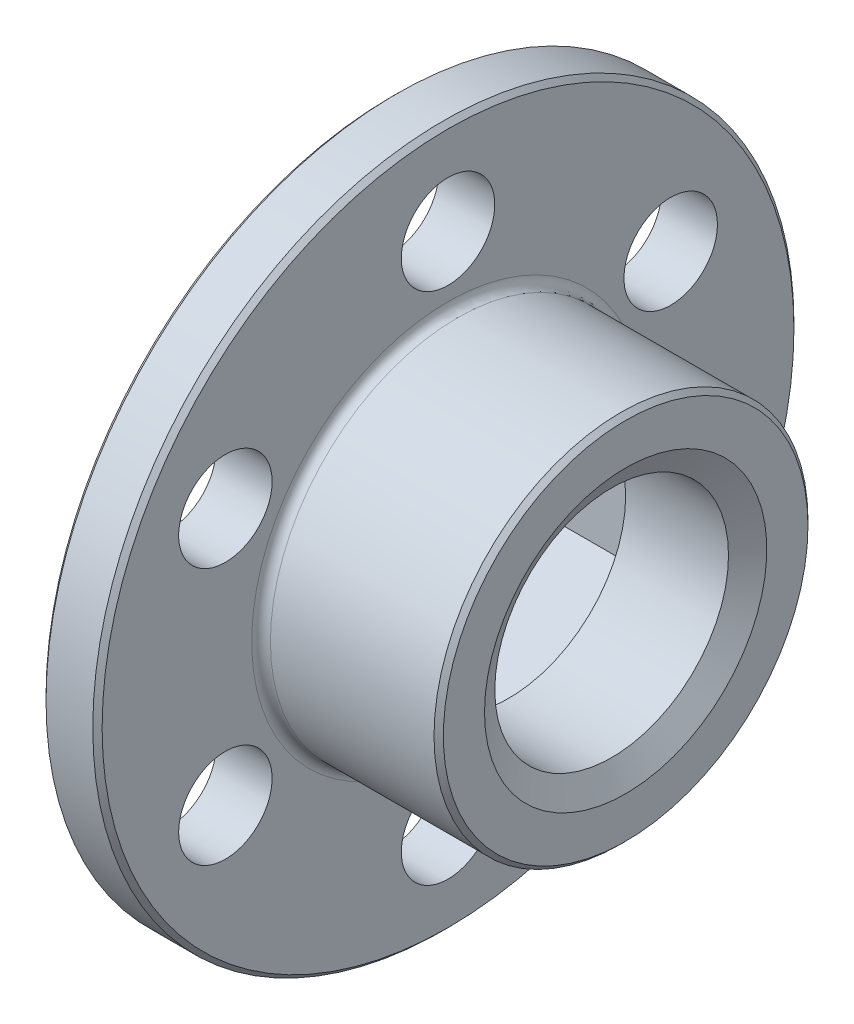
ISO-10303-21;
HEADER;
FILE_DESCRIPTION(('STEP AP214'),'2;1');
FILE_NAME('part.step','',(''),(''),'','','');
FILE_SCHEMA(('AUTOMOTIVE_DESIGN { 1 0 10303 214 1 1 1 1 }'));
ENDSEC;
DATA;
#1=APPLICATION_CONTEXT('core data for automotive mechanical design processes');
#2=APPLICATION_PROTOCOL_DEFINITION('international standard','automotive_design',2000,#1);
#3=PRODUCT_CONTEXT('',#1,'mechanical');
#4=PRODUCT('Part','Part','',(#3));
#5=PRODUCT_RELATED_PRODUCT_CATEGORY('part','',(#4));
#6=PRODUCT_DEFINITION_FORMATION('','',#4);
#7=PRODUCT_DEFINITION_CONTEXT('part definition',#1,'design');
#8=PRODUCT_DEFINITION('design','',#6,#7);
#9=PRODUCT_DEFINITION_SHAPE('','',#8);
#10=(LENGTH_UNIT() NAMED_UNIT(*) SI_UNIT(.MILLI.,.METRE.));
#11=(NAMED_UNIT(*) PLANE_ANGLE_UNIT() SI_UNIT($,.RADIAN.));
#12=(NAMED_UNIT(*) SI_UNIT($,.STERADIAN.) SOLID_ANGLE_UNIT());
#13=UNCERTAINTY_MEASURE_WITH_UNIT(LENGTH_MEASURE(1.E-05),#10,'distance_accuracy_value','');
#14=(GEOMETRIC_REPRESENTATION_CONTEXT(3) GLOBAL_UNCERTAINTY_ASSIGNED_CONTEXT((#13)) GLOBAL_UNIT_ASSIGNED_CONTEXT((#10,
#11,#12)) REPRESENTATION_CONTEXT('',''));
#15=CARTESIAN_POINT('',(0.,0.,0.));
#16=DIRECTION('',(0.,0.,1.));
#17=DIRECTION('',(1.,0.,0.));
#18=AXIS2_PLACEMENT_3D('',#15,#16,#17);
#19=CARTESIAN_POINT('',(0.,0.,0.));
#20=DIRECTION('',(-1.,0.,0.));
#21=DIRECTION('',(0.,0.,1.));
#22=AXIS2_PLACEMENT_3D('',#19,#20,#21);
#23=PLANE('',#22);
#24=DIRECTION('',(0.,0.5,0.866025403784439));
#25=VECTOR('',#24,1.);
#26=CARTESIAN_POINT('',(0.,17.5,-30.3108891324554));
#27=LINE('',#26,#25);
#28=CARTESIAN_POINT('',(0.,17.5,-30.3108891324554));
#29=VERTEX_POINT('',#28);
#30=CARTESIAN_POINT('',(0.,35.,0.));
#31=VERTEX_POINT('',#30);
#32=EDGE_CURVE('E138',#29,#31,#27,.T.);
#33=ORIENTED_EDGE('',*,*,#32,.T.);
#34=DIRECTION('',(0.,-0.5,0.866025403784439));
#35=VECTOR('',#34,1.);
#36=CARTESIAN_POINT('',(0.,35.,0.));
#37=LINE('',#36,#35);
#38=CARTESIAN_POINT('',(0.,17.5,30.3108891324554));
#39=VERTEX_POINT('',#38);
#40=EDGE_CURVE('E120',#31,#39,#37,.T.);
#41=ORIENTED_EDGE('',*,*,#40,.T.);
#42=DIRECTION('',(0.,-1.,0.));
#43=VECTOR('',#42,1.);
#44=CARTESIAN_POINT('',(0.,17.5,30.3108891324554));
#45=LINE('',#44,#43);
#46=CARTESIAN_POINT('',(0.,-17.5,30.3108891324554));
#47=VERTEX_POINT('',#46);
#48=EDGE_CURVE('E52',#39,#47,#45,.T.);
#49=ORIENTED_EDGE('',*,*,#48,.T.);
#50=DIRECTION('',(0.,-0.5,-0.866025403784439));
#51=VECTOR('',#50,1.);
#52=CARTESIAN_POINT('',(0.,-17.5,30.3108891324554));
#53=LINE('',#52,#51);
#54=CARTESIAN_POINT('',(0.,-35.,0.));
#55=VERTEX_POINT('',#54);
#56=EDGE_CURVE('E100',#47,#55,#53,.T.);
#57=ORIENTED_EDGE('',*,*,#56,.T.);
#58=DIRECTION('',(0.,0.5,-0.866025403784439));
#59=VECTOR('',#58,1.);
#60=CARTESIAN_POINT('',(0.,-35.,0.));
#61=LINE('',#60,#59);
#62=CARTESIAN_POINT('',(0.,-17.5,-30.3108891324554));
#63=VERTEX_POINT('',#62);
#64=EDGE_CURVE('E110',#55,#63,#61,.T.);
#65=ORIENTED_EDGE('',*,*,#64,.T.);
#66=DIRECTION('',(0.,1.,0.));
#67=VECTOR('',#66,1.);
#68=CARTESIAN_POINT('',(0.,-17.5,-30.3108891324554));
#69=LINE('',#68,#67);
#70=EDGE_CURVE('E114',#63,#29,#69,.T.);
#71=ORIENTED_EDGE('',*,*,#70,.T.);
#72=EDGE_LOOP('',(#33,#41,#49,#57,#65,#71));
#73=FACE_BOUND('',#72,.T.);
#74=CARTESIAN_POINT('',(0.,27.5000000000006,47.6313972081438));
#75=DIRECTION('',(-1.,0.,0.));
#76=DIRECTION('',(0.,-0.866025403784433,0.50000000000001));
#77=AXIS2_PLACEMENT_3D('',#74,#75,#76);
#78=CIRCLE('',#77,10.);
#79=CARTESIAN_POINT('',(0.,18.8397459621562,52.6313972081439));
#80=VERTEX_POINT('',#79);
#81=EDGE_CURVE('E151',#80,#80,#78,.T.);
#82=ORIENTED_EDGE('',*,*,#81,.F.);
#83=EDGE_LOOP('',(#82));
#84=FACE_BOUND('',#83,.T.);
#85=CARTESIAN_POINT('',(0.,-27.4999999999996,47.6313972081444));
#86=DIRECTION('',(-1.,0.,0.));
#87=DIRECTION('',(0.,-0.866025403784443,-0.499999999999992));
#88=AXIS2_PLACEMENT_3D('',#85,#86,#87);
#89=CIRCLE('',#88,10.);
#90=CARTESIAN_POINT('',(0.,-36.160254037844,42.6313972081445));
#91=VERTEX_POINT('',#90);
#92=EDGE_CURVE('E157',#91,#91,#89,.T.);
#93=ORIENTED_EDGE('',*,*,#92,.F.);
#94=EDGE_LOOP('',(#93));
#95=FACE_BOUND('',#94,.T.);
#96=CARTESIAN_POINT('',(0.,-55.,0.));
#97=DIRECTION('',(-1.,0.,0.));
#98=DIRECTION('',(0.,0.,-1.));
#99=AXIS2_PLACEMENT_3D('',#96,#97,#98);
#100=CIRCLE('',#99,10.);
#101=CARTESIAN_POINT('',(0.,-55.,-10.));
#102=VERTEX_POINT('',#101);
#103=EDGE_CURVE('E163',#102,#102,#100,.T.);
#104=ORIENTED_EDGE('',*,*,#103,.F.);
#105=EDGE_LOOP('',(#104));
#106=FACE_BOUND('',#105,.T.);
#107=CARTESIAN_POINT('',(0.,-27.5000000000002,-47.631397208144));
#108=DIRECTION('',(-1.,0.,0.));
#109=DIRECTION('',(0.,0.866025403784436,-0.500000000000004));
#110=AXIS2_PLACEMENT_3D('',#107,#108,#109);
#111=CIRCLE('',#110,10.);
#112=CARTESIAN_POINT('',(0.,-18.8397459621559,-52.631397208144));
#113=VERTEX_POINT('',#112);
#114=EDGE_CURVE('E169',#113,#113,#111,.T.);
#115=ORIENTED_EDGE('',*,*,#114,.F.);
#116=EDGE_LOOP('',(#115));
#117=FACE_BOUND('',#116,.T.);
#118=CARTESIAN_POINT('',(0.,27.4999999999999,-47.6313972081442));
#119=DIRECTION('',(-1.,0.,0.));
#120=DIRECTION('',(0.,0.86602540378444,0.499999999999998));
#121=AXIS2_PLACEMENT_3D('',#118,#119,#120);
#122=CIRCLE('',#121,10.);
#123=CARTESIAN_POINT('',(0.,36.1602540378443,-42.6313972081442));
#124=VERTEX_POINT('',#123);
#125=EDGE_CURVE('E175',#124,#124,#122,.T.);
#126=ORIENTED_EDGE('',*,*,#125,.F.);
#127=EDGE_LOOP('',(#126));
#128=FACE_BOUND('',#127,.T.);
#129=CARTESIAN_POINT('',(0.,55.,0.));
#130=DIRECTION('',(-1.,0.,0.));
#131=DIRECTION('',(0.,0.,1.));
#132=AXIS2_PLACEMENT_3D('',#129,#130,#131);
#133=CIRCLE('',#132,10.);
#134=CARTESIAN_POINT('',(0.,55.,10.));
#135=VERTEX_POINT('',#134);
#136=EDGE_CURVE('E181',#135,#135,#133,.T.);
#137=ORIENTED_EDGE('',*,*,#136,.F.);
#138=EDGE_LOOP('',(#137));
#139=FACE_BOUND('',#138,.T.);
#140=CARTESIAN_POINT('',(0.,0.,0.));
#141=DIRECTION('',(-1.,0.,0.));
#142=DIRECTION('',(0.,0.,1.));
#143=AXIS2_PLACEMENT_3D('',#140,#141,#142);
#144=CIRCLE('',#143,74.0000000000001);
#145=CARTESIAN_POINT('',(0.,0.,74.0000000000001));
#146=VERTEX_POINT('',#145);
#147=EDGE_CURVE('E199',#146,#146,#144,.T.);
#148=ORIENTED_EDGE('',*,*,#147,.T.);
#149=EDGE_LOOP('',(#148));
#150=FACE_BOUND('',#149,.T.);
#151=ADVANCED_FACE('F36',(#73,#84,#95,#106,#117,#128,#139,#150),#23,.T.);
#152=CARTESIAN_POINT('',(0.,0.,0.));
#153=DIRECTION('',(-1.,0.,0.));
#154=DIRECTION('',(0.,0.,1.));
#155=AXIS2_PLACEMENT_3D('',#152,#153,#154);
#156=CYLINDRICAL_SURFACE('',#155,25.);
#157=CARTESIAN_POINT('',(25.,0.,0.));
#158=DIRECTION('',(1.,0.,0.));
#159=DIRECTION('',(0.,0.,-1.));
#160=AXIS2_PLACEMENT_3D('',#157,#158,#159);
#161=CIRCLE('',#160,25.);
#162=CARTESIAN_POINT('',(25.,0.,-25.));
#163=VERTEX_POINT('',#162);
#164=EDGE_CURVE('E40',#163,#163,#161,.F.);
#165=ORIENTED_EDGE('',*,*,#164,.T.);
#166=EDGE_LOOP('',(#165));
#167=FACE_BOUND('',#166,.T.);
#168=CARTESIAN_POINT('',(47.,0.,0.));
#169=DIRECTION('',(-1.,0.,0.));
#170=DIRECTION('',(0.,0.,1.));
#171=AXIS2_PLACEMENT_3D('',#168,#169,#170);
#172=CIRCLE('',#171,25.);
#173=CARTESIAN_POINT('',(47.,0.,25.));
#174=VERTEX_POINT('',#173);
#175=EDGE_CURVE('E145',#174,#174,#172,.T.);
#176=ORIENTED_EDGE('',*,*,#175,.F.);
#177=EDGE_LOOP('',(#176));
#178=FACE_BOUND('',#177,.T.);
#179=ADVANCED_FACE('F218',(#167,#178),#156,.F.);
#180=CARTESIAN_POINT('',(50.,0.,0.));
#181=DIRECTION('',(1.,0.,0.));
#182=DIRECTION('',(0.,0.,-1.));
#183=AXIS2_PLACEMENT_3D('',#180,#181,#182);
#184=PLANE('',#183);
#185=CARTESIAN_POINT('',(50.,0.,0.));
#186=DIRECTION('',(-1.,0.,0.));
#187=DIRECTION('',(0.,0.,1.));
#188=AXIS2_PLACEMENT_3D('',#185,#186,#187);
#189=CIRCLE('',#188,30.1961524227067);
#190=CARTESIAN_POINT('',(50.,0.,30.1961524227067));
#191=VERTEX_POINT('',#190);
#192=EDGE_CURVE('E148',#191,#191,#189,.T.);
#193=ORIENTED_EDGE('',*,*,#192,.T.);
#194=EDGE_LOOP('',(#193));
#195=FACE_BOUND('',#194,.T.);
#196=CARTESIAN_POINT('',(50.,0.,0.));
#197=DIRECTION('',(1.,0.,0.));
#198=DIRECTION('',(0.,0.,-1.));
#199=AXIS2_PLACEMENT_3D('',#196,#197,#198);
#200=CIRCLE('',#199,39.);
#201=CARTESIAN_POINT('',(50.,0.,-39.));
#202=VERTEX_POINT('',#201);
#203=EDGE_CURVE('E196',#202,#202,#200,.T.);
#204=ORIENTED_EDGE('',*,*,#203,.T.);
#205=EDGE_LOOP('',(#204));
#206=FACE_BOUND('',#205,.T.);
#207=ADVANCED_FACE('F223',(#195,#206),#184,.T.);
#208=CARTESIAN_POINT('',(0.,0.,0.));
#209=DIRECTION('',(-1.,0.,0.));
#210=DIRECTION('',(0.,0.,1.));
#211=AXIS2_PLACEMENT_3D('',#208,#209,#210);
#212=CYLINDRICAL_SURFACE('',#211,40.);
#213=CARTESIAN_POINT('',(49.,0.,0.));
#214=DIRECTION('',(1.,0.,0.));
#215=DIRECTION('',(0.,0.,-1.));
#216=AXIS2_PLACEMENT_3D('',#213,#214,#215);
#217=CIRCLE('',#216,40.);
#218=CARTESIAN_POINT('',(49.,0.,-40.));
#219=VERTEX_POINT('',#218);
#220=EDGE_CURVE('E193',#219,#219,#217,.F.);
#221=ORIENTED_EDGE('',*,*,#220,.T.);
#222=EDGE_LOOP('',(#221));
#223=FACE_BOUND('',#222,.T.);
#224=CARTESIAN_POINT('',(14.,0.,0.));
#225=DIRECTION('',(1.,0.,0.));
#226=DIRECTION('',(0.,0.,-1.));
#227=AXIS2_PLACEMENT_3D('',#224,#225,#226);
#228=CIRCLE('',#227,40.);
#229=CARTESIAN_POINT('',(14.,0.,-40.));
#230=VERTEX_POINT('',#229);
#231=EDGE_CURVE('E190',#230,#230,#228,.T.);
#232=ORIENTED_EDGE('',*,*,#231,.T.);
#233=EDGE_LOOP('',(#232));
#234=FACE_BOUND('',#233,.T.);
#235=ADVANCED_FACE('F240',(#223,#234),#212,.T.);
#236=CARTESIAN_POINT('',(12.,0.,0.));
#237=DIRECTION('',(1.,0.,0.));
#238=DIRECTION('',(0.,0.,-1.));
#239=AXIS2_PLACEMENT_3D('',#236,#237,#238);
#240=PLANE('',#239);
#241=CARTESIAN_POINT('',(12.,27.5000000000006,47.6313972081438));
#242=DIRECTION('',(-1.,0.,0.));
#243=DIRECTION('',(0.,-0.866025403784433,0.50000000000001));
#244=AXIS2_PLACEMENT_3D('',#241,#242,#243);
#245=CIRCLE('',#244,10.);
#246=CARTESIAN_POINT('',(12.,18.8397459621562,52.6313972081439));
#247=VERTEX_POINT('',#246);
#248=EDGE_CURVE('E154',#247,#247,#245,.T.);
#249=ORIENTED_EDGE('',*,*,#248,.T.);
#250=EDGE_LOOP('',(#249));
#251=FACE_BOUND('',#250,.T.);
#252=CARTESIAN_POINT('',(12.,-27.4999999999996,47.6313972081444));
#253=DIRECTION('',(-1.,0.,0.));
#254=DIRECTION('',(0.,-0.866025403784443,-0.499999999999992));
#255=AXIS2_PLACEMENT_3D('',#252,#253,#254);
#256=CIRCLE('',#255,10.);
#257=CARTESIAN_POINT('',(12.,-36.160254037844,42.6313972081445));
#258=VERTEX_POINT('',#257);
#259=EDGE_CURVE('E160',#258,#258,#256,.T.);
#260=ORIENTED_EDGE('',*,*,#259,.T.);
#261=EDGE_LOOP('',(#260));
#262=FACE_BOUND('',#261,.T.);
#263=CARTESIAN_POINT('',(12.,-55.,0.));
#264=DIRECTION('',(-1.,0.,0.));
#265=DIRECTION('',(0.,0.,-1.));
#266=AXIS2_PLACEMENT_3D('',#263,#264,#265);
#267=CIRCLE('',#266,10.);
#268=CARTESIAN_POINT('',(12.,-55.,-10.));
#269=VERTEX_POINT('',#268);
#270=EDGE_CURVE('E166',#269,#269,#267,.T.);
#271=ORIENTED_EDGE('',*,*,#270,.T.);
#272=EDGE_LOOP('',(#271));
#273=FACE_BOUND('',#272,.T.);
#274=CARTESIAN_POINT('',(12.,-27.5000000000002,-47.631397208144));
#275=DIRECTION('',(-1.,0.,0.));
#276=DIRECTION('',(0.,0.866025403784436,-0.500000000000004));
#277=AXIS2_PLACEMENT_3D('',#274,#275,#276);
#278=CIRCLE('',#277,10.);
#279=CARTESIAN_POINT('',(12.,-18.8397459621559,-52.631397208144));
#280=VERTEX_POINT('',#279);
#281=EDGE_CURVE('E172',#280,#280,#278,.T.);
#282=ORIENTED_EDGE('',*,*,#281,.T.);
#283=EDGE_LOOP('',(#282));
#284=FACE_BOUND('',#283,.T.);
#285=CARTESIAN_POINT('',(12.,27.4999999999999,-47.6313972081442));
#286=DIRECTION('',(-1.,0.,0.));
#287=DIRECTION('',(0.,0.86602540378444,0.499999999999998));
#288=AXIS2_PLACEMENT_3D('',#285,#286,#287);
#289=CIRCLE('',#288,10.);
#290=CARTESIAN_POINT('',(12.,36.1602540378443,-42.6313972081442));
#291=VERTEX_POINT('',#290);
#292=EDGE_CURVE('E178',#291,#291,#289,.T.);
#293=ORIENTED_EDGE('',*,*,#292,.T.);
#294=EDGE_LOOP('',(#293));
#295=FACE_BOUND('',#294,.T.);
#296=CARTESIAN_POINT('',(12.,55.,0.));
#297=DIRECTION('',(-1.,0.,0.));
#298=DIRECTION('',(0.,0.,1.));
#299=AXIS2_PLACEMENT_3D('',#296,#297,#298);
#300=CIRCLE('',#299,10.);
#301=CARTESIAN_POINT('',(12.,55.,10.));
#302=VERTEX_POINT('',#301);
#303=EDGE_CURVE('E184',#302,#302,#300,.T.);
#304=ORIENTED_EDGE('',*,*,#303,.T.);
#305=EDGE_LOOP('',(#304));
#306=FACE_BOUND('',#305,.T.);
#307=CARTESIAN_POINT('',(12.,0.,0.));
#308=DIRECTION('',(1.,0.,0.));
#309=DIRECTION('',(0.,0.,-1.));
#310=AXIS2_PLACEMENT_3D('',#307,#308,#309);
#311=CIRCLE('',#310,74.);
#312=CARTESIAN_POINT('',(12.,0.,-74.));
#313=VERTEX_POINT('',#312);
#314=EDGE_CURVE('E11',#313,#313,#311,.T.);
#315=ORIENTED_EDGE('',*,*,#314,.T.);
#316=EDGE_LOOP('',(#315));
#317=FACE_BOUND('',#316,.T.);
#318=CARTESIAN_POINT('',(12.,0.,0.));
#319=DIRECTION('',(1.,0.,0.));
#320=DIRECTION('',(0.,0.,-1.));
#321=AXIS2_PLACEMENT_3D('',#318,#319,#320);
#322=CIRCLE('',#321,42.);
#323=CARTESIAN_POINT('',(12.,0.,-42.));
#324=VERTEX_POINT('',#323);
#325=EDGE_CURVE('E187',#324,#324,#322,.F.);
#326=ORIENTED_EDGE('',*,*,#325,.T.);
#327=EDGE_LOOP('',(#326));
#328=FACE_BOUND('',#327,.T.);
#329=ADVANCED_FACE('F243',(#251,#262,#273,#284,#295,#306,#317,#328),#240,.T.);
#330=CARTESIAN_POINT('',(0.,0.,0.));
#331=DIRECTION('',(-1.,0.,0.));
#332=DIRECTION('',(0.,0.,1.));
#333=AXIS2_PLACEMENT_3D('',#330,#331,#332);
#334=CYLINDRICAL_SURFACE('',#333,75.);
#335=CARTESIAN_POINT('',(0.999999999999918,0.,0.));
#336=DIRECTION('',(-1.,0.,0.));
#337=DIRECTION('',(0.,0.,1.));
#338=AXIS2_PLACEMENT_3D('',#335,#336,#337);
#339=CIRCLE('',#338,75.);
#340=CARTESIAN_POINT('',(0.999999999999918,0.,75.));
#341=VERTEX_POINT('',#340);
#342=EDGE_CURVE('E45',#341,#341,#339,.F.);
#343=ORIENTED_EDGE('',*,*,#342,.T.);
#344=EDGE_LOOP('',(#343));
#345=FACE_BOUND('',#344,.T.);
#346=CARTESIAN_POINT('',(11.,0.,0.));
#347=DIRECTION('',(1.,0.,0.));
#348=DIRECTION('',(0.,0.,-1.));
#349=AXIS2_PLACEMENT_3D('',#346,#347,#348);
#350=CIRCLE('',#349,75.);
#351=CARTESIAN_POINT('',(11.,0.,-75.));
#352=VERTEX_POINT('',#351);
#353=EDGE_CURVE('E202',#352,#352,#350,.F.);
#354=ORIENTED_EDGE('',*,*,#353,.T.);
#355=EDGE_LOOP('',(#354));
#356=FACE_BOUND('',#355,.T.);
#357=ADVANCED_FACE('F208',(#345,#356),#334,.T.);
#358=CARTESIAN_POINT('',(14.,0.,0.));
#359=DIRECTION('',(1.,0.,0.));
#360=DIRECTION('',(0.,0.,-1.));
#361=AXIS2_PLACEMENT_3D('',#358,#359,#360);
#362=TOROIDAL_SURFACE('',#361,42.,2.);
#363=ORIENTED_EDGE('',*,*,#231,.F.);
#364=EDGE_LOOP('',(#363));
#365=FACE_BOUND('',#364,.T.);
#366=ORIENTED_EDGE('',*,*,#325,.F.);
#367=EDGE_LOOP('',(#366));
#368=FACE_BOUND('',#367,.T.);
#369=ADVANCED_FACE('F228',(#365,#368),#362,.F.);
#370=CARTESIAN_POINT('',(49.,0.,0.));
#371=DIRECTION('',(-1.,0.,0.));
#372=DIRECTION('',(0.,0.,1.));
#373=AXIS2_PLACEMENT_3D('',#370,#371,#372);
#374=CONICAL_SURFACE('',#373,40.,0.785398163397462);
#375=ORIENTED_EDGE('',*,*,#203,.F.);
#376=EDGE_LOOP('',(#375));
#377=FACE_BOUND('',#376,.T.);
#378=ORIENTED_EDGE('',*,*,#220,.F.);
#379=EDGE_LOOP('',(#378));
#380=FACE_BOUND('',#379,.T.);
#381=ADVANCED_FACE('F214',(#377,#380),#374,.T.);
#382=CARTESIAN_POINT('',(0.,0.,0.));
#383=DIRECTION('',(1.,0.,0.));
#384=DIRECTION('',(0.,0.,-1.));
#385=AXIS2_PLACEMENT_3D('',#382,#383,#384);
#386=CONICAL_SURFACE('',#385,74.0000000000001,0.785398163397455);
#387=ORIENTED_EDGE('',*,*,#342,.F.);
#388=EDGE_LOOP('',(#387));
#389=FACE_BOUND('',#388,.T.);
#390=ORIENTED_EDGE('',*,*,#147,.F.);
#391=EDGE_LOOP('',(#390));
#392=FACE_BOUND('',#391,.T.);
#393=ADVANCED_FACE('F211',(#389,#392),#386,.T.);
#394=CARTESIAN_POINT('',(11.,0.,0.));
#395=DIRECTION('',(-1.,0.,0.));
#396=DIRECTION('',(0.,0.,1.));
#397=AXIS2_PLACEMENT_3D('',#394,#395,#396);
#398=CONICAL_SURFACE('',#397,75.,0.785398163397455);
#399=ORIENTED_EDGE('',*,*,#314,.F.);
#400=EDGE_LOOP('',(#399));
#401=FACE_BOUND('',#400,.T.);
#402=ORIENTED_EDGE('',*,*,#353,.F.);
#403=EDGE_LOOP('',(#402));
#404=FACE_BOUND('',#403,.T.);
#405=ADVANCED_FACE('F38',(#401,#404),#398,.T.);
#406=CARTESIAN_POINT('',(-8.26577211769879,55.,0.));
#407=DIRECTION('',(-1.,0.,0.));
#408=DIRECTION('',(0.,0.,1.));
#409=AXIS2_PLACEMENT_3D('',#406,#407,#408);
#410=CYLINDRICAL_SURFACE('',#409,10.);
#411=ORIENTED_EDGE('',*,*,#303,.F.);
#412=EDGE_LOOP('',(#411));
#413=FACE_BOUND('',#412,.T.);
#414=ORIENTED_EDGE('',*,*,#136,.T.);
#415=EDGE_LOOP('',(#414));
#416=FACE_BOUND('',#415,.T.);
#417=ADVANCED_FACE('F299',(#413,#416),#410,.F.);
#418=CARTESIAN_POINT('',(-8.26577211769879,27.4999999999999,-47.6313972081442));
#419=DIRECTION('',(-1.,0.,0.));
#420=DIRECTION('',(0.,0.86602540378444,0.499999999999998));
#421=AXIS2_PLACEMENT_3D('',#418,#419,#420);
#422=CYLINDRICAL_SURFACE('',#421,10.);
#423=ORIENTED_EDGE('',*,*,#292,.F.);
#424=EDGE_LOOP('',(#423));
#425=FACE_BOUND('',#424,.T.);
#426=ORIENTED_EDGE('',*,*,#125,.T.);
#427=EDGE_LOOP('',(#426));
#428=FACE_BOUND('',#427,.T.);
#429=ADVANCED_FACE('F296',(#425,#428),#422,.F.);
#430=CARTESIAN_POINT('',(-8.26577211769879,-27.5000000000002,-47.631397208144));
#431=DIRECTION('',(-1.,0.,0.));
#432=DIRECTION('',(0.,0.866025403784436,-0.500000000000004));
#433=AXIS2_PLACEMENT_3D('',#430,#431,#432);
#434=CYLINDRICAL_SURFACE('',#433,10.);
#435=ORIENTED_EDGE('',*,*,#281,.F.);
#436=EDGE_LOOP('',(#435));
#437=FACE_BOUND('',#436,.T.);
#438=ORIENTED_EDGE('',*,*,#114,.T.);
#439=EDGE_LOOP('',(#438));
#440=FACE_BOUND('',#439,.T.);
#441=ADVANCED_FACE('F292',(#437,#440),#434,.F.);
#442=CARTESIAN_POINT('',(-8.26577211769879,-55.,0.));
#443=DIRECTION('',(-1.,0.,0.));
#444=DIRECTION('',(0.,0.,-1.));
#445=AXIS2_PLACEMENT_3D('',#442,#443,#444);
#446=CYLINDRICAL_SURFACE('',#445,10.);
#447=ORIENTED_EDGE('',*,*,#270,.F.);
#448=EDGE_LOOP('',(#447));
#449=FACE_BOUND('',#448,.T.);
#450=ORIENTED_EDGE('',*,*,#103,.T.);
#451=EDGE_LOOP('',(#450));
#452=FACE_BOUND('',#451,.T.);
#453=ADVANCED_FACE('F288',(#449,#452),#446,.F.);
#454=CARTESIAN_POINT('',(-8.26577211769879,-27.4999999999996,47.6313972081444));
#455=DIRECTION('',(-1.,0.,0.));
#456=DIRECTION('',(0.,-0.866025403784443,-0.499999999999992));
#457=AXIS2_PLACEMENT_3D('',#454,#455,#456);
#458=CYLINDRICAL_SURFACE('',#457,10.);
#459=ORIENTED_EDGE('',*,*,#259,.F.);
#460=EDGE_LOOP('',(#459));
#461=FACE_BOUND('',#460,.T.);
#462=ORIENTED_EDGE('',*,*,#92,.T.);
#463=EDGE_LOOP('',(#462));
#464=FACE_BOUND('',#463,.T.);
#465=ADVANCED_FACE('F280',(#461,#464),#458,.F.);
#466=CARTESIAN_POINT('',(-8.26577211769879,27.5000000000006,47.6313972081438));
#467=DIRECTION('',(-1.,0.,0.));
#468=DIRECTION('',(0.,-0.866025403784433,0.50000000000001));
#469=AXIS2_PLACEMENT_3D('',#466,#467,#468);
#470=CYLINDRICAL_SURFACE('',#469,10.);
#471=ORIENTED_EDGE('',*,*,#248,.F.);
#472=EDGE_LOOP('',(#471));
#473=FACE_BOUND('',#472,.T.);
#474=ORIENTED_EDGE('',*,*,#81,.T.);
#475=EDGE_LOOP('',(#474));
#476=FACE_BOUND('',#475,.T.);
#477=ADVANCED_FACE('F269',(#473,#476),#470,.F.);
#478=CARTESIAN_POINT('',(47.,0.,0.));
#479=DIRECTION('',(1.,0.,0.));
#480=DIRECTION('',(0.,0.,-1.));
#481=AXIS2_PLACEMENT_3D('',#478,#479,#480);
#482=CONICAL_SURFACE('',#481,25.,1.0471975511966);
#483=ORIENTED_EDGE('',*,*,#192,.F.);
#484=EDGE_LOOP('',(#483));
#485=FACE_BOUND('',#484,.T.);
#486=ORIENTED_EDGE('',*,*,#175,.T.);
#487=EDGE_LOOP('',(#486));
#488=FACE_BOUND('',#487,.T.);
#489=ADVANCED_FACE('F265',(#485,#488),#482,.F.);
#490=CARTESIAN_POINT('',(25.,0.,0.));
#491=DIRECTION('',(1.,0.,0.));
#492=DIRECTION('',(0.,0.,-1.));
#493=AXIS2_PLACEMENT_3D('',#490,#491,#492);
#494=PLANE('',#493);
#495=DIRECTION('',(0.,0.5,0.866025403784439));
#496=VECTOR('',#495,1.);
#497=CARTESIAN_POINT('',(25.,17.5,-30.3108891324554));
#498=LINE('',#497,#496);
#499=CARTESIAN_POINT('',(25.,17.5,-30.3108891324554));
#500=VERTEX_POINT('',#499);
#501=CARTESIAN_POINT('',(25.,35.,0.));
#502=VERTEX_POINT('',#501);
#503=EDGE_CURVE('E125',#500,#502,#498,.T.);
#504=ORIENTED_EDGE('',*,*,#503,.F.);
#505=DIRECTION('',(0.,1.,0.));
#506=VECTOR('',#505,1.);
#507=CARTESIAN_POINT('',(25.,-17.5,-30.3108891324554));
#508=LINE('',#507,#506);
#509=CARTESIAN_POINT('',(25.,-17.5,-30.3108891324554));
#510=VERTEX_POINT('',#509);
#511=EDGE_CURVE('E136',#510,#500,#508,.T.);
#512=ORIENTED_EDGE('',*,*,#511,.F.);
#513=DIRECTION('',(0.,0.5,-0.866025403784439));
#514=VECTOR('',#513,1.);
#515=CARTESIAN_POINT('',(25.,-35.,0.));
#516=LINE('',#515,#514);
#517=CARTESIAN_POINT('',(25.,-35.,0.));
#518=VERTEX_POINT('',#517);
#519=EDGE_CURVE('E134',#518,#510,#516,.T.);
#520=ORIENTED_EDGE('',*,*,#519,.F.);
#521=DIRECTION('',(0.,-0.5,-0.866025403784439));
#522=VECTOR('',#521,1.);
#523=CARTESIAN_POINT('',(25.,-17.5,30.3108891324554));
#524=LINE('',#523,#522);
#525=CARTESIAN_POINT('',(25.,-17.5,30.3108891324554));
#526=VERTEX_POINT('',#525);
#527=EDGE_CURVE('E102',#526,#518,#524,.T.);
#528=ORIENTED_EDGE('',*,*,#527,.F.);
#529=DIRECTION('',(0.,-1.,0.));
#530=VECTOR('',#529,1.);
#531=CARTESIAN_POINT('',(25.,17.5,30.3108891324554));
#532=LINE('',#531,#530);
#533=CARTESIAN_POINT('',(25.,17.5,30.3108891324554));
#534=VERTEX_POINT('',#533);
#535=EDGE_CURVE('E130',#534,#526,#532,.T.);
#536=ORIENTED_EDGE('',*,*,#535,.F.);
#537=DIRECTION('',(0.,-0.5,0.866025403784439));
#538=VECTOR('',#537,1.);
#539=CARTESIAN_POINT('',(25.,35.,0.));
#540=LINE('',#539,#538);
#541=EDGE_CURVE('E127',#502,#534,#540,.T.);
#542=ORIENTED_EDGE('',*,*,#541,.F.);
#543=EDGE_LOOP('',(#504,#512,#520,#528,#536,#542));
#544=FACE_BOUND('',#543,.T.);
#545=ORIENTED_EDGE('',*,*,#164,.F.);
#546=EDGE_LOOP('',(#545));
#547=FACE_BOUND('',#546,.T.);
#548=ADVANCED_FACE('F268',(#544,#547),#494,.F.);
#549=CARTESIAN_POINT('',(0.,17.5,-30.3108891324554));
#550=DIRECTION('',(0.,0.866025403784439,-0.5));
#551=DIRECTION('',(0.,0.5,0.866025403784439));
#552=AXIS2_PLACEMENT_3D('',#549,#550,#551);
#553=PLANE('',#552);
#554=ORIENTED_EDGE('',*,*,#503,.T.);
#555=DIRECTION('',(1.,0.,0.));
#556=VECTOR('',#555,1.);
#557=CARTESIAN_POINT('',(0.,35.,0.));
#558=LINE('',#557,#556);
#559=EDGE_CURVE('E89',#31,#502,#558,.T.);
#560=ORIENTED_EDGE('',*,*,#559,.F.);
#561=ORIENTED_EDGE('',*,*,#32,.F.);
#562=DIRECTION('',(1.,0.,0.));
#563=VECTOR('',#562,1.);
#564=CARTESIAN_POINT('',(0.,17.5,-30.3108891324554));
#565=LINE('',#564,#563);
#566=EDGE_CURVE('E61',#29,#500,#565,.T.);
#567=ORIENTED_EDGE('',*,*,#566,.T.);
#568=EDGE_LOOP('',(#554,#560,#561,#567));
#569=FACE_BOUND('',#568,.T.);
#570=ADVANCED_FACE('F277',(#569),#553,.F.);
#571=CARTESIAN_POINT('',(0.,-17.5,-30.3108891324554));
#572=DIRECTION('',(0.,0.,-1.));
#573=DIRECTION('',(0.,1.,0.));
#574=AXIS2_PLACEMENT_3D('',#571,#572,#573);
#575=PLANE('',#574);
#576=ORIENTED_EDGE('',*,*,#511,.T.);
#577=ORIENTED_EDGE('',*,*,#566,.F.);
#578=ORIENTED_EDGE('',*,*,#70,.F.);
#579=DIRECTION('',(1.,0.,0.));
#580=VECTOR('',#579,1.);
#581=CARTESIAN_POINT('',(0.,-17.5,-30.3108891324554));
#582=LINE('',#581,#580);
#583=EDGE_CURVE('E106',#63,#510,#582,.T.);
#584=ORIENTED_EDGE('',*,*,#583,.T.);
#585=EDGE_LOOP('',(#576,#577,#578,#584));
#586=FACE_BOUND('',#585,.T.);
#587=ADVANCED_FACE('F413',(#586),#575,.F.);
#588=CARTESIAN_POINT('',(0.,-35.,0.));
#589=DIRECTION('',(0.,-0.866025403784439,-0.5));
#590=DIRECTION('',(0.,0.5,-0.866025403784439));
#591=AXIS2_PLACEMENT_3D('',#588,#589,#590);
#592=PLANE('',#591);
#593=ORIENTED_EDGE('',*,*,#519,.T.);
#594=ORIENTED_EDGE('',*,*,#583,.F.);
#595=ORIENTED_EDGE('',*,*,#64,.F.);
#596=DIRECTION('',(1.,0.,0.));
#597=VECTOR('',#596,1.);
#598=CARTESIAN_POINT('',(0.,-35.,0.));
#599=LINE('',#598,#597);
#600=EDGE_CURVE('E96',#55,#518,#599,.T.);
#601=ORIENTED_EDGE('',*,*,#600,.T.);
#602=EDGE_LOOP('',(#593,#594,#595,#601));
#603=FACE_BOUND('',#602,.T.);
#604=ADVANCED_FACE('F111',(#603),#592,.F.);
#605=CARTESIAN_POINT('',(0.,-17.5,30.3108891324554));
#606=DIRECTION('',(0.,-0.866025403784439,0.5));
#607=DIRECTION('',(0.,-0.5,-0.866025403784439));
#608=AXIS2_PLACEMENT_3D('',#605,#606,#607);
#609=PLANE('',#608);
#610=ORIENTED_EDGE('',*,*,#527,.T.);
#611=ORIENTED_EDGE('',*,*,#600,.F.);
#612=ORIENTED_EDGE('',*,*,#56,.F.);
#613=DIRECTION('',(1.,0.,0.));
#614=VECTOR('',#613,1.);
#615=CARTESIAN_POINT('',(0.,-17.5,30.3108891324554));
#616=LINE('',#615,#614);
#617=EDGE_CURVE('E107',#47,#526,#616,.T.);
#618=ORIENTED_EDGE('',*,*,#617,.T.);
#619=EDGE_LOOP('',(#610,#611,#612,#618));
#620=FACE_BOUND('',#619,.T.);
#621=ADVANCED_FACE('F98',(#620),#609,.F.);
#622=CARTESIAN_POINT('',(0.,17.5,30.3108891324554));
#623=DIRECTION('',(0.,0.,1.));
#624=DIRECTION('',(1.,0.,0.));
#625=AXIS2_PLACEMENT_3D('',#622,#623,#624);
#626=PLANE('',#625);
#627=ORIENTED_EDGE('',*,*,#535,.T.);
#628=ORIENTED_EDGE('',*,*,#617,.F.);
#629=ORIENTED_EDGE('',*,*,#48,.F.);
#630=DIRECTION('',(1.,0.,0.));
#631=VECTOR('',#630,1.);
#632=CARTESIAN_POINT('',(0.,17.5,30.3108891324554));
#633=LINE('',#632,#631);
#634=EDGE_CURVE('E142',#39,#534,#633,.T.);
#635=ORIENTED_EDGE('',*,*,#634,.T.);
#636=EDGE_LOOP('',(#627,#628,#629,#635));
#637=FACE_BOUND('',#636,.T.);
#638=ADVANCED_FACE('F437',(#637),#626,.F.);
#639=CARTESIAN_POINT('',(0.,35.,0.));
#640=DIRECTION('',(0.,0.866025403784439,0.5));
#641=DIRECTION('',(0.,-0.5,0.866025403784439));
#642=AXIS2_PLACEMENT_3D('',#639,#640,#641);
#643=PLANE('',#642);
#644=ORIENTED_EDGE('',*,*,#541,.T.);
#645=ORIENTED_EDGE('',*,*,#634,.F.);
#646=ORIENTED_EDGE('',*,*,#40,.F.);
#647=ORIENTED_EDGE('',*,*,#559,.T.);
#648=EDGE_LOOP('',(#644,#645,#646,#647));
#649=FACE_BOUND('',#648,.T.);
#650=ADVANCED_FACE('F446',(#649),#643,.F.);
#651=CLOSED_SHELL('',(#151,#179,#207,#235,#329,#357,#369,#381,#393,#405,#417,#429,#441,#453,
#465,#477,#489,#548,#570,#587,#604,#621,#638,#650));
#652=MANIFOLD_SOLID_BREP('B2',#651);
#653=ADVANCED_BREP_SHAPE_REPRESENTATION('',(#18,#652),#14);
#654=SHAPE_DEFINITION_REPRESENTATION(#9,#653);
ENDSEC;
END-ISO-10303-21;
